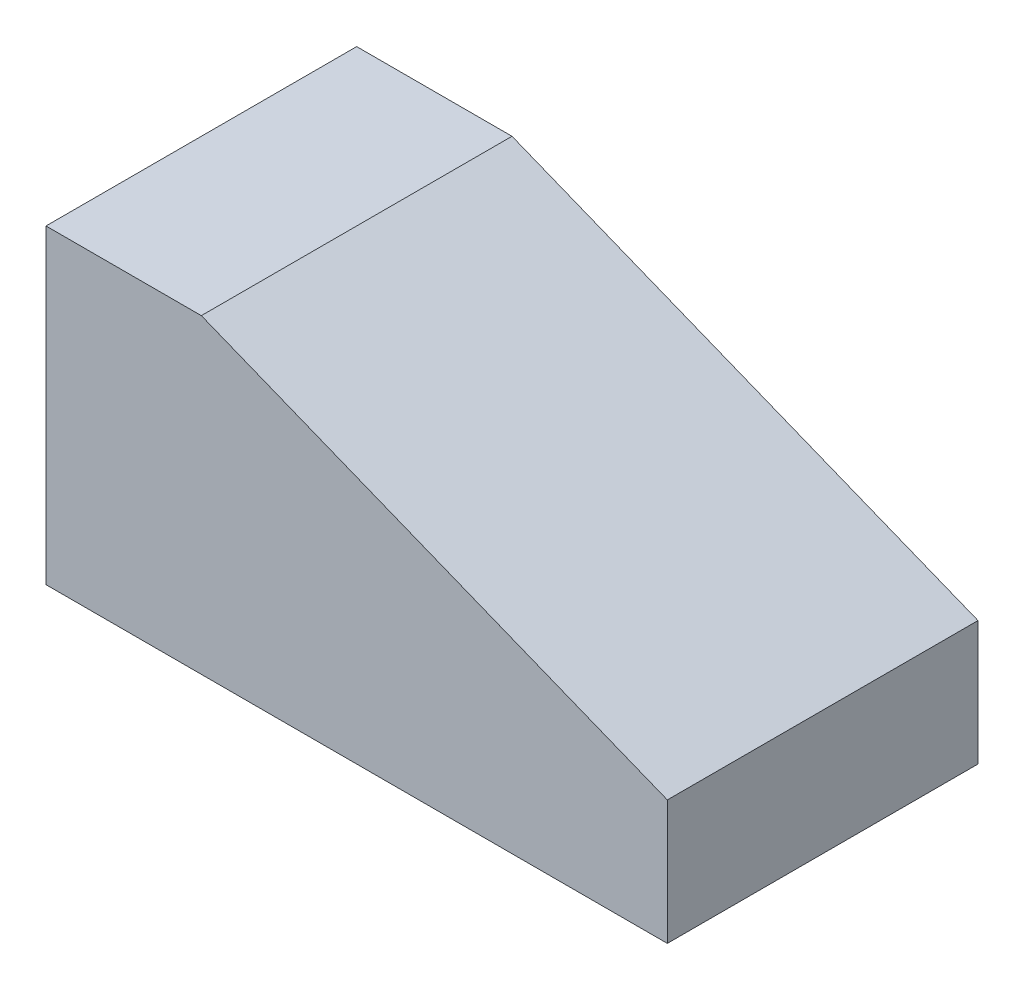
ISO-10303-21;
HEADER;
FILE_DESCRIPTION(('STEP AP214'),'2;1');
FILE_NAME('part.step','',(''),(''),'','','');
FILE_SCHEMA(('AUTOMOTIVE_DESIGN { 1 0 10303 214 1 1 1 1 }'));
ENDSEC;
DATA;
#1=APPLICATION_CONTEXT('core data for automotive mechanical design processes');
#2=APPLICATION_PROTOCOL_DEFINITION('international standard','automotive_design',2000,#1);
#3=PRODUCT_CONTEXT('',#1,'mechanical');
#4=PRODUCT('Part','Part','',(#3));
#5=PRODUCT_RELATED_PRODUCT_CATEGORY('part','',(#4));
#6=PRODUCT_DEFINITION_FORMATION('','',#4);
#7=PRODUCT_DEFINITION_CONTEXT('part definition',#1,'design');
#8=PRODUCT_DEFINITION('design','',#6,#7);
#9=PRODUCT_DEFINITION_SHAPE('','',#8);
#10=(LENGTH_UNIT() NAMED_UNIT(*) SI_UNIT(.MILLI.,.METRE.));
#11=(NAMED_UNIT(*) PLANE_ANGLE_UNIT() SI_UNIT($,.RADIAN.));
#12=(NAMED_UNIT(*) SI_UNIT($,.STERADIAN.) SOLID_ANGLE_UNIT());
#13=UNCERTAINTY_MEASURE_WITH_UNIT(LENGTH_MEASURE(1.E-05),#10,'distance_accuracy_value','');
#14=(GEOMETRIC_REPRESENTATION_CONTEXT(3) GLOBAL_UNCERTAINTY_ASSIGNED_CONTEXT((#13)) GLOBAL_UNIT_ASSIGNED_CONTEXT((#10,
#11,#12)) REPRESENTATION_CONTEXT('',''));
#15=CARTESIAN_POINT('',(0.,0.,0.));
#16=DIRECTION('',(0.,0.,1.));
#17=DIRECTION('',(1.,0.,0.));
#18=AXIS2_PLACEMENT_3D('',#15,#16,#17);
#19=CARTESIAN_POINT('',(0.,50.,50.));
#20=DIRECTION('',(1.,0.,0.));
#21=DIRECTION('',(0.,1.,0.));
#22=AXIS2_PLACEMENT_3D('',#19,#20,#21);
#23=PLANE('',#22);
#24=DIRECTION('',(0.,-1.,0.));
#25=VECTOR('',#24,1.);
#26=CARTESIAN_POINT('',(0.,50.,0.));
#27=LINE('',#26,#25);
#28=CARTESIAN_POINT('',(0.,50.,0.));
#29=VERTEX_POINT('',#28);
#30=CARTESIAN_POINT('',(0.,0.,0.));
#31=VERTEX_POINT('',#30);
#32=EDGE_CURVE('E106',#29,#31,#27,.T.);
#33=ORIENTED_EDGE('',*,*,#32,.T.);
#34=DIRECTION('',(0.,0.,-1.));
#35=VECTOR('',#34,1.);
#36=CARTESIAN_POINT('',(0.,0.,50.));
#37=LINE('',#36,#35);
#38=CARTESIAN_POINT('',(0.,0.,50.));
#39=VERTEX_POINT('',#38);
#40=EDGE_CURVE('E11',#39,#31,#37,.T.);
#41=ORIENTED_EDGE('',*,*,#40,.F.);
#42=DIRECTION('',(0.,-1.,0.));
#43=VECTOR('',#42,1.);
#44=CARTESIAN_POINT('',(0.,50.,50.));
#45=LINE('',#44,#43);
#46=CARTESIAN_POINT('',(0.,50.,50.));
#47=VERTEX_POINT('',#46);
#48=EDGE_CURVE('E114',#47,#39,#45,.T.);
#49=ORIENTED_EDGE('',*,*,#48,.F.);
#50=DIRECTION('',(0.,0.,-1.));
#51=VECTOR('',#50,1.);
#52=CARTESIAN_POINT('',(0.,50.,50.));
#53=LINE('',#52,#51);
#54=EDGE_CURVE('E102',#47,#29,#53,.T.);
#55=ORIENTED_EDGE('',*,*,#54,.T.);
#56=EDGE_LOOP('',(#33,#41,#49,#55));
#57=FACE_BOUND('',#56,.T.);
#58=ADVANCED_FACE('F32',(#57),#23,.F.);
#59=CARTESIAN_POINT('',(0.,0.,50.));
#60=DIRECTION('',(0.,1.,0.));
#61=DIRECTION('',(0.,0.,1.));
#62=AXIS2_PLACEMENT_3D('',#59,#60,#61);
#63=PLANE('',#62);
#64=DIRECTION('',(1.,0.,0.));
#65=VECTOR('',#64,1.);
#66=CARTESIAN_POINT('',(0.,0.,0.));
#67=LINE('',#66,#65);
#68=CARTESIAN_POINT('',(100.,0.,0.));
#69=VERTEX_POINT('',#68);
#70=EDGE_CURVE('E109',#31,#69,#67,.T.);
#71=ORIENTED_EDGE('',*,*,#70,.T.);
#72=DIRECTION('',(0.,0.,-1.));
#73=VECTOR('',#72,1.);
#74=CARTESIAN_POINT('',(100.,0.,50.));
#75=LINE('',#74,#73);
#76=CARTESIAN_POINT('',(100.,0.,50.));
#77=VERTEX_POINT('',#76);
#78=EDGE_CURVE('E40',#77,#69,#75,.T.);
#79=ORIENTED_EDGE('',*,*,#78,.F.);
#80=DIRECTION('',(1.,0.,0.));
#81=VECTOR('',#80,1.);
#82=CARTESIAN_POINT('',(0.,0.,50.));
#83=LINE('',#82,#81);
#84=EDGE_CURVE('E82',#39,#77,#83,.T.);
#85=ORIENTED_EDGE('',*,*,#84,.F.);
#86=ORIENTED_EDGE('',*,*,#40,.T.);
#87=EDGE_LOOP('',(#71,#79,#85,#86));
#88=FACE_BOUND('',#87,.T.);
#89=ADVANCED_FACE('F133',(#88),#63,.F.);
#90=CARTESIAN_POINT('',(100.,0.,50.));
#91=DIRECTION('',(-1.,0.,0.));
#92=DIRECTION('',(0.,0.,1.));
#93=AXIS2_PLACEMENT_3D('',#90,#91,#92);
#94=PLANE('',#93);
#95=DIRECTION('',(0.,1.,0.));
#96=VECTOR('',#95,1.);
#97=CARTESIAN_POINT('',(100.,0.,0.));
#98=LINE('',#97,#96);
#99=CARTESIAN_POINT('',(100.,20.,0.));
#100=VERTEX_POINT('',#99);
#101=EDGE_CURVE('E97',#69,#100,#98,.T.);
#102=ORIENTED_EDGE('',*,*,#101,.T.);
#103=DIRECTION('',(0.,0.,-1.));
#104=VECTOR('',#103,1.);
#105=CARTESIAN_POINT('',(100.,20.,50.));
#106=LINE('',#105,#104);
#107=CARTESIAN_POINT('',(100.,20.,50.));
#108=VERTEX_POINT('',#107);
#109=EDGE_CURVE('E94',#108,#100,#106,.T.);
#110=ORIENTED_EDGE('',*,*,#109,.F.);
#111=DIRECTION('',(0.,1.,0.));
#112=VECTOR('',#111,1.);
#113=CARTESIAN_POINT('',(100.,0.,50.));
#114=LINE('',#113,#112);
#115=EDGE_CURVE('E86',#77,#108,#114,.T.);
#116=ORIENTED_EDGE('',*,*,#115,.F.);
#117=ORIENTED_EDGE('',*,*,#78,.T.);
#118=EDGE_LOOP('',(#102,#110,#116,#117));
#119=FACE_BOUND('',#118,.T.);
#120=ADVANCED_FACE('F95',(#119),#94,.F.);
#121=CARTESIAN_POINT('',(100.,20.,50.));
#122=DIRECTION('',(-0.371390676354104,-0.928476690885259,0.));
#123=DIRECTION('',(0.928476690885259,-0.371390676354104,0.));
#124=AXIS2_PLACEMENT_3D('',#121,#122,#123);
#125=PLANE('',#124);
#126=DIRECTION('',(-0.928476690885259,0.371390676354104,0.));
#127=VECTOR('',#126,1.);
#128=CARTESIAN_POINT('',(100.,20.,0.));
#129=LINE('',#128,#127);
#130=CARTESIAN_POINT('',(25.,50.,0.));
#131=VERTEX_POINT('',#130);
#132=EDGE_CURVE('E68',#100,#131,#129,.T.);
#133=ORIENTED_EDGE('',*,*,#132,.T.);
#134=DIRECTION('',(0.,0.,-1.));
#135=VECTOR('',#134,1.);
#136=CARTESIAN_POINT('',(25.,50.,50.));
#137=LINE('',#136,#135);
#138=CARTESIAN_POINT('',(25.,50.,50.));
#139=VERTEX_POINT('',#138);
#140=EDGE_CURVE('E98',#139,#131,#137,.T.);
#141=ORIENTED_EDGE('',*,*,#140,.F.);
#142=DIRECTION('',(-0.928476690885259,0.371390676354104,0.));
#143=VECTOR('',#142,1.);
#144=CARTESIAN_POINT('',(100.,20.,50.));
#145=LINE('',#144,#143);
#146=EDGE_CURVE('E90',#108,#139,#145,.T.);
#147=ORIENTED_EDGE('',*,*,#146,.F.);
#148=ORIENTED_EDGE('',*,*,#109,.T.);
#149=EDGE_LOOP('',(#133,#141,#147,#148));
#150=FACE_BOUND('',#149,.T.);
#151=ADVANCED_FACE('F100',(#150),#125,.F.);
#152=CARTESIAN_POINT('',(25.,50.,50.));
#153=DIRECTION('',(0.,-1.,0.));
#154=DIRECTION('',(0.,0.,-1.));
#155=AXIS2_PLACEMENT_3D('',#152,#153,#154);
#156=PLANE('',#155);
#157=DIRECTION('',(-1.,0.,0.));
#158=VECTOR('',#157,1.);
#159=CARTESIAN_POINT('',(25.,50.,0.));
#160=LINE('',#159,#158);
#161=EDGE_CURVE('E74',#131,#29,#160,.T.);
#162=ORIENTED_EDGE('',*,*,#161,.T.);
#163=ORIENTED_EDGE('',*,*,#54,.F.);
#164=DIRECTION('',(-1.,0.,0.));
#165=VECTOR('',#164,1.);
#166=CARTESIAN_POINT('',(25.,50.,50.));
#167=LINE('',#166,#165);
#168=EDGE_CURVE('E48',#139,#47,#167,.T.);
#169=ORIENTED_EDGE('',*,*,#168,.F.);
#170=ORIENTED_EDGE('',*,*,#140,.T.);
#171=EDGE_LOOP('',(#162,#163,#169,#170));
#172=FACE_BOUND('',#171,.T.);
#173=ADVANCED_FACE('F122',(#172),#156,.F.);
#174=CARTESIAN_POINT('',(0.,0.,50.));
#175=DIRECTION('',(0.,0.,1.));
#176=DIRECTION('',(1.,0.,0.));
#177=AXIS2_PLACEMENT_3D('',#174,#175,#176);
#178=PLANE('',#177);
#179=ORIENTED_EDGE('',*,*,#48,.T.);
#180=ORIENTED_EDGE('',*,*,#84,.T.);
#181=ORIENTED_EDGE('',*,*,#115,.T.);
#182=ORIENTED_EDGE('',*,*,#146,.T.);
#183=ORIENTED_EDGE('',*,*,#168,.T.);
#184=EDGE_LOOP('',(#179,#180,#181,#182,#183));
#185=FACE_BOUND('',#184,.T.);
#186=ADVANCED_FACE('F88',(#185),#178,.T.);
#187=CARTESIAN_POINT('',(0.,0.,0.));
#188=DIRECTION('',(0.,0.,1.));
#189=DIRECTION('',(1.,0.,0.));
#190=AXIS2_PLACEMENT_3D('',#187,#188,#189);
#191=PLANE('',#190);
#192=ORIENTED_EDGE('',*,*,#32,.F.);
#193=ORIENTED_EDGE('',*,*,#161,.F.);
#194=ORIENTED_EDGE('',*,*,#132,.F.);
#195=ORIENTED_EDGE('',*,*,#101,.F.);
#196=ORIENTED_EDGE('',*,*,#70,.F.);
#197=EDGE_LOOP('',(#192,#193,#194,#195,#196));
#198=FACE_BOUND('',#197,.T.);
#199=ADVANCED_FACE('F118',(#198),#191,.F.);
#200=CLOSED_SHELL('',(#58,#89,#120,#151,#173,#186,#199));
#201=MANIFOLD_SOLID_BREP('B2',#200);
#202=ADVANCED_BREP_SHAPE_REPRESENTATION('',(#18,#201),#14);
#203=SHAPE_DEFINITION_REPRESENTATION(#9,#202);
ENDSEC;
END-ISO-10303-21;
